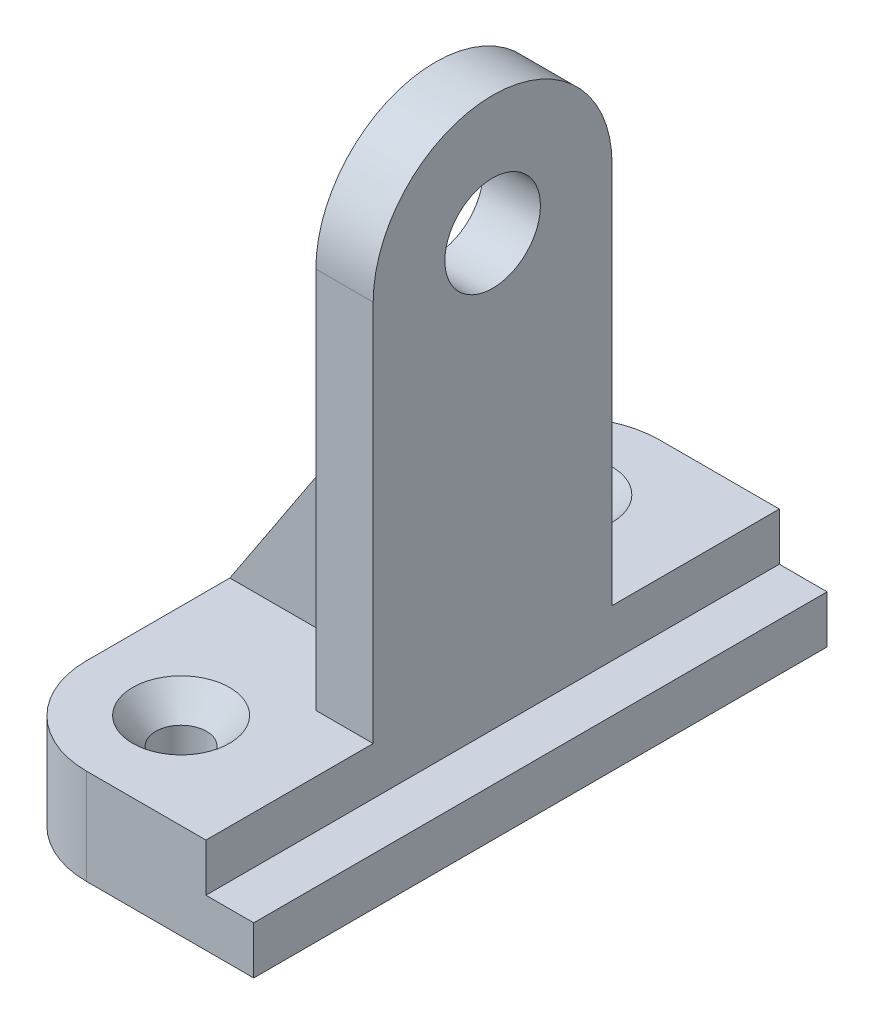
ISO-10303-21;
HEADER;
FILE_DESCRIPTION(('STEP AP214'),'2;1');
FILE_NAME('part.step','',(''),(''),'','','');
FILE_SCHEMA(('AUTOMOTIVE_DESIGN { 1 0 10303 214 1 1 1 1 }'));
ENDSEC;
DATA;
#1=APPLICATION_CONTEXT('core data for automotive mechanical design processes');
#2=APPLICATION_PROTOCOL_DEFINITION('international standard','automotive_design',2000,#1);
#3=PRODUCT_CONTEXT('',#1,'mechanical');
#4=PRODUCT('Part','Part','',(#3));
#5=PRODUCT_RELATED_PRODUCT_CATEGORY('part','',(#4));
#6=PRODUCT_DEFINITION_FORMATION('','',#4);
#7=PRODUCT_DEFINITION_CONTEXT('part definition',#1,'design');
#8=PRODUCT_DEFINITION('design','',#6,#7);
#9=PRODUCT_DEFINITION_SHAPE('','',#8);
#10=(LENGTH_UNIT() NAMED_UNIT(*) SI_UNIT(.MILLI.,.METRE.));
#11=(NAMED_UNIT(*) PLANE_ANGLE_UNIT() SI_UNIT($,.RADIAN.));
#12=(NAMED_UNIT(*) SI_UNIT($,.STERADIAN.) SOLID_ANGLE_UNIT());
#13=UNCERTAINTY_MEASURE_WITH_UNIT(LENGTH_MEASURE(1.E-05),#10,'distance_accuracy_value','');
#14=(GEOMETRIC_REPRESENTATION_CONTEXT(3) GLOBAL_UNCERTAINTY_ASSIGNED_CONTEXT((#13)) GLOBAL_UNIT_ASSIGNED_CONTEXT((#10,
#11,#12)) REPRESENTATION_CONTEXT('',''));
#15=CARTESIAN_POINT('',(0.,0.,0.));
#16=DIRECTION('',(0.,0.,1.));
#17=DIRECTION('',(1.,0.,0.));
#18=AXIS2_PLACEMENT_3D('',#15,#16,#17);
#19=CARTESIAN_POINT('',(-34.925,12.7,38.1));
#20=DIRECTION('',(0.,-1.,0.));
#21=DIRECTION('',(0.,0.,-1.));
#22=AXIS2_PLACEMENT_3D('',#19,#20,#21);
#23=PLANE('',#22);
#24=DIRECTION('',(0.,0.,-1.));
#25=VECTOR('',#24,1.);
#26=CARTESIAN_POINT('',(-34.925,12.7,38.1));
#27=LINE('',#26,#25);
#28=CARTESIAN_POINT('',(-34.925,12.7,25.4));
#29=VERTEX_POINT('',#28);
#30=CARTESIAN_POINT('',(-34.925,12.7,6.35000000000002));
#31=VERTEX_POINT('',#30);
#32=EDGE_CURVE('E278',#29,#31,#27,.T.);
#33=ORIENTED_EDGE('',*,*,#32,.F.);
#34=CARTESIAN_POINT('',(-22.225,12.7,25.4));
#35=DIRECTION('',(0.,-1.,0.));
#36=DIRECTION('',(0.,0.,-1.));
#37=AXIS2_PLACEMENT_3D('',#34,#35,#36);
#38=CIRCLE('',#37,12.7);
#39=CARTESIAN_POINT('',(-22.225,12.7,38.1));
#40=VERTEX_POINT('',#39);
#41=EDGE_CURVE('E11',#29,#40,#38,.F.);
#42=ORIENTED_EDGE('',*,*,#41,.T.);
#43=DIRECTION('',(-1.,0.,0.));
#44=VECTOR('',#43,1.);
#45=CARTESIAN_POINT('',(-34.925,12.7,38.1));
#46=LINE('',#45,#44);
#47=CARTESIAN_POINT('',(-6.35,12.7,38.1));
#48=VERTEX_POINT('',#47);
#49=EDGE_CURVE('E249',#48,#40,#46,.T.);
#50=ORIENTED_EDGE('',*,*,#49,.F.);
#51=DIRECTION('',(0.,0.,-1.));
#52=VECTOR('',#51,1.);
#53=CARTESIAN_POINT('',(-6.35,12.7,38.1));
#54=LINE('',#53,#52);
#55=CARTESIAN_POINT('',(-6.35,12.7,15.875));
#56=VERTEX_POINT('',#55);
#57=EDGE_CURVE('E282',#48,#56,#54,.T.);
#58=ORIENTED_EDGE('',*,*,#57,.T.);
#59=DIRECTION('',(1.,0.,0.));
#60=VECTOR('',#59,1.);
#61=CARTESIAN_POINT('',(-13.97,12.7,15.875));
#62=LINE('',#61,#60);
#63=CARTESIAN_POINT('',(-13.97,12.7,15.875));
#64=VERTEX_POINT('',#63);
#65=EDGE_CURVE('E230',#64,#56,#62,.T.);
#66=ORIENTED_EDGE('',*,*,#65,.F.);
#67=DIRECTION('',(0.,0.,1.));
#68=VECTOR('',#67,1.);
#69=CARTESIAN_POINT('',(-13.97,12.7,0.));
#70=LINE('',#69,#68);
#71=CARTESIAN_POINT('',(-13.97,12.7,6.35));
#72=VERTEX_POINT('',#71);
#73=EDGE_CURVE('E167',#72,#64,#70,.T.);
#74=ORIENTED_EDGE('',*,*,#73,.F.);
#75=DIRECTION('',(1.,0.,0.));
#76=VECTOR('',#75,1.);
#77=CARTESIAN_POINT('',(-13.97,12.7,6.35));
#78=LINE('',#77,#76);
#79=EDGE_CURVE('E186',#31,#72,#78,.T.);
#80=ORIENTED_EDGE('',*,*,#79,.F.);
#81=EDGE_LOOP('',(#33,#42,#50,#58,#66,#74,#80));
#82=FACE_BOUND('',#81,.T.);
#83=CARTESIAN_POINT('',(-22.352,12.7,25.4));
#84=DIRECTION('',(0.,1.,0.));
#85=DIRECTION('',(0.,0.,1.));
#86=AXIS2_PLACEMENT_3D('',#83,#84,#85);
#87=CIRCLE('',#86,6.4389);
#88=CARTESIAN_POINT('',(-22.352,12.7,31.8389));
#89=VERTEX_POINT('',#88);
#90=EDGE_CURVE('E344',#89,#89,#87,.T.);
#91=ORIENTED_EDGE('',*,*,#90,.F.);
#92=EDGE_LOOP('',(#91));
#93=FACE_BOUND('',#92,.T.);
#94=ADVANCED_FACE('F43',(#82,#93),#23,.F.);
#95=CARTESIAN_POINT('',(-22.352,12.7,-25.4));
#96=DIRECTION('',(0.,1.,0.));
#97=DIRECTION('',(0.,0.,1.));
#98=AXIS2_PLACEMENT_3D('',#95,#96,#97);
#99=CIRCLE('',#98,6.4389);
#100=CARTESIAN_POINT('',(-22.352,12.7,-18.9611));
#101=VERTEX_POINT('',#100);
#102=EDGE_CURVE('E627',#101,#101,#99,.T.);
#103=ORIENTED_EDGE('',*,*,#102,.F.);
#104=EDGE_LOOP('',(#103));
#105=FACE_BOUND('',#104,.T.);
#106=DIRECTION('',(-1.,0.,0.));
#107=VECTOR('',#106,1.);
#108=CARTESIAN_POINT('',(-34.925,12.7,-38.1));
#109=LINE('',#108,#107);
#110=CARTESIAN_POINT('',(-6.35,12.7,-38.1));
#111=VERTEX_POINT('',#110);
#112=CARTESIAN_POINT('',(-22.225,12.7,-38.1));
#113=VERTEX_POINT('',#112);
#114=EDGE_CURVE('E266',#111,#113,#109,.T.);
#115=ORIENTED_EDGE('',*,*,#114,.T.);
#116=CARTESIAN_POINT('',(-22.225,12.7,-25.4));
#117=DIRECTION('',(0.,-1.,0.));
#118=DIRECTION('',(0.,0.,-1.));
#119=AXIS2_PLACEMENT_3D('',#116,#117,#118);
#120=CIRCLE('',#119,12.7);
#121=CARTESIAN_POINT('',(-34.925,12.7,-25.4));
#122=VERTEX_POINT('',#121);
#123=EDGE_CURVE('E309',#113,#122,#120,.F.);
#124=ORIENTED_EDGE('',*,*,#123,.T.);
#125=CARTESIAN_POINT('',(-34.925,12.7,-6.34999999999999));
#126=VERTEX_POINT('',#125);
#127=EDGE_CURVE('E173',#126,#122,#27,.T.);
#128=ORIENTED_EDGE('',*,*,#127,.F.);
#129=DIRECTION('',(1.,0.,0.));
#130=VECTOR('',#129,1.);
#131=CARTESIAN_POINT('',(-13.97,12.7,-6.35));
#132=LINE('',#131,#130);
#133=CARTESIAN_POINT('',(-13.97,12.7,-6.35));
#134=VERTEX_POINT('',#133);
#135=EDGE_CURVE('E170',#126,#134,#132,.T.);
#136=ORIENTED_EDGE('',*,*,#135,.T.);
#137=CARTESIAN_POINT('',(-13.97,12.7,-15.875));
#138=VERTEX_POINT('',#137);
#139=EDGE_CURVE('E152',#138,#134,#70,.T.);
#140=ORIENTED_EDGE('',*,*,#139,.F.);
#141=DIRECTION('',(1.,0.,0.));
#142=VECTOR('',#141,1.);
#143=CARTESIAN_POINT('',(-13.97,12.7,-15.875));
#144=LINE('',#143,#142);
#145=CARTESIAN_POINT('',(-6.35,12.7,-15.875));
#146=VERTEX_POINT('',#145);
#147=EDGE_CURVE('E226',#138,#146,#144,.T.);
#148=ORIENTED_EDGE('',*,*,#147,.T.);
#149=EDGE_CURVE('E281',#146,#111,#54,.T.);
#150=ORIENTED_EDGE('',*,*,#149,.T.);
#151=EDGE_LOOP('',(#115,#124,#128,#136,#140,#148,#150));
#152=FACE_BOUND('',#151,.T.);
#153=ADVANCED_FACE('F171',(#105,#152),#23,.F.);
#154=CARTESIAN_POINT('',(0.,6.35,38.1));
#155=DIRECTION('',(-1.,0.,0.));
#156=DIRECTION('',(0.,-1.,0.));
#157=AXIS2_PLACEMENT_3D('',#154,#155,#156);
#158=PLANE('',#157);
#159=DIRECTION('',(0.,1.,0.));
#160=VECTOR('',#159,1.);
#161=CARTESIAN_POINT('',(0.,6.35,-38.1));
#162=LINE('',#161,#160);
#163=CARTESIAN_POINT('',(0.,0.,-38.1));
#164=VERTEX_POINT('',#163);
#165=CARTESIAN_POINT('',(0.,6.35,-38.1));
#166=VERTEX_POINT('',#165);
#167=EDGE_CURVE('E229',#164,#166,#162,.T.);
#168=ORIENTED_EDGE('',*,*,#167,.T.);
#169=DIRECTION('',(0.,0.,-1.));
#170=VECTOR('',#169,1.);
#171=CARTESIAN_POINT('',(0.,6.35,38.1));
#172=LINE('',#171,#170);
#173=CARTESIAN_POINT('',(0.,6.35,38.1));
#174=VERTEX_POINT('',#173);
#175=EDGE_CURVE('E290',#174,#166,#172,.T.);
#176=ORIENTED_EDGE('',*,*,#175,.F.);
#177=DIRECTION('',(0.,1.,0.));
#178=VECTOR('',#177,1.);
#179=CARTESIAN_POINT('',(0.,6.35,38.1));
#180=LINE('',#179,#178);
#181=CARTESIAN_POINT('',(0.,0.,38.1));
#182=VERTEX_POINT('',#181);
#183=EDGE_CURVE('E238',#182,#174,#180,.T.);
#184=ORIENTED_EDGE('',*,*,#183,.F.);
#185=DIRECTION('',(0.,0.,-1.));
#186=VECTOR('',#185,1.);
#187=CARTESIAN_POINT('',(0.,0.,38.1));
#188=LINE('',#187,#186);
#189=EDGE_CURVE('E255',#182,#164,#188,.T.);
#190=ORIENTED_EDGE('',*,*,#189,.T.);
#191=EDGE_LOOP('',(#168,#176,#184,#190));
#192=FACE_BOUND('',#191,.T.);
#193=ADVANCED_FACE('F326',(#192),#158,.F.);
#194=CARTESIAN_POINT('',(-6.35,6.35,38.1));
#195=DIRECTION('',(0.,-1.,0.));
#196=DIRECTION('',(0.,0.,-1.));
#197=AXIS2_PLACEMENT_3D('',#194,#195,#196);
#198=PLANE('',#197);
#199=DIRECTION('',(-1.,0.,0.));
#200=VECTOR('',#199,1.);
#201=CARTESIAN_POINT('',(-6.35,6.35,-38.1));
#202=LINE('',#201,#200);
#203=CARTESIAN_POINT('',(-6.35,6.35,-38.1));
#204=VERTEX_POINT('',#203);
#205=EDGE_CURVE('E259',#166,#204,#202,.T.);
#206=ORIENTED_EDGE('',*,*,#205,.T.);
#207=DIRECTION('',(0.,0.,-1.));
#208=VECTOR('',#207,1.);
#209=CARTESIAN_POINT('',(-6.35,6.35,38.1));
#210=LINE('',#209,#208);
#211=CARTESIAN_POINT('',(-6.35,6.35,38.1));
#212=VERTEX_POINT('',#211);
#213=EDGE_CURVE('E286',#212,#204,#210,.T.);
#214=ORIENTED_EDGE('',*,*,#213,.F.);
#215=DIRECTION('',(-1.,0.,0.));
#216=VECTOR('',#215,1.);
#217=CARTESIAN_POINT('',(-6.35,6.35,38.1));
#218=LINE('',#217,#216);
#219=EDGE_CURVE('E242',#174,#212,#218,.T.);
#220=ORIENTED_EDGE('',*,*,#219,.F.);
#221=ORIENTED_EDGE('',*,*,#175,.T.);
#222=EDGE_LOOP('',(#206,#214,#220,#221));
#223=FACE_BOUND('',#222,.T.);
#224=ADVANCED_FACE('F331',(#223),#198,.F.);
#225=CARTESIAN_POINT('',(-6.35,12.7,38.1));
#226=DIRECTION('',(-1.,0.,0.));
#227=DIRECTION('',(0.,-1.,0.));
#228=AXIS2_PLACEMENT_3D('',#225,#226,#227);
#229=PLANE('',#228);
#230=DIRECTION('',(0.,1.,0.));
#231=VECTOR('',#230,1.);
#232=CARTESIAN_POINT('',(-6.35,12.7,-38.1));
#233=LINE('',#232,#231);
#234=EDGE_CURVE('E262',#204,#111,#233,.T.);
#235=ORIENTED_EDGE('',*,*,#234,.T.);
#236=ORIENTED_EDGE('',*,*,#149,.F.);
#237=DIRECTION('',(0.,-1.,0.));
#238=VECTOR('',#237,1.);
#239=CARTESIAN_POINT('',(-6.35,0.,-15.875));
#240=LINE('',#239,#238);
#241=CARTESIAN_POINT('',(-6.35000000000002,63.5,-15.875));
#242=VERTEX_POINT('',#241);
#243=EDGE_CURVE('E197',#242,#146,#240,.T.);
#244=ORIENTED_EDGE('',*,*,#243,.F.);
#245=CARTESIAN_POINT('',(-6.35000000000002,63.5,0.));
#246=DIRECTION('',(1.,0.,0.));
#247=DIRECTION('',(0.,1.,0.));
#248=AXIS2_PLACEMENT_3D('',#245,#246,#247);
#249=CIRCLE('',#248,15.875);
#250=CARTESIAN_POINT('',(-6.35000000000002,63.5,15.875));
#251=VERTEX_POINT('',#250);
#252=EDGE_CURVE('E215',#242,#251,#249,.T.);
#253=ORIENTED_EDGE('',*,*,#252,.T.);
#254=DIRECTION('',(0.,-1.,0.));
#255=VECTOR('',#254,1.);
#256=CARTESIAN_POINT('',(-6.35,0.,15.875));
#257=LINE('',#256,#255);
#258=EDGE_CURVE('E219',#251,#56,#257,.T.);
#259=ORIENTED_EDGE('',*,*,#258,.T.);
#260=ORIENTED_EDGE('',*,*,#57,.F.);
#261=DIRECTION('',(0.,1.,0.));
#262=VECTOR('',#261,1.);
#263=CARTESIAN_POINT('',(-6.35,12.7,38.1));
#264=LINE('',#263,#262);
#265=EDGE_CURVE('E246',#212,#48,#264,.T.);
#266=ORIENTED_EDGE('',*,*,#265,.F.);
#267=ORIENTED_EDGE('',*,*,#213,.T.);
#268=EDGE_LOOP('',(#235,#236,#244,#253,#259,#260,#266,#267));
#269=FACE_BOUND('',#268,.T.);
#270=CARTESIAN_POINT('',(-6.35000000000002,63.5,0.));
#271=DIRECTION('',(1.,0.,0.));
#272=DIRECTION('',(0.,1.,0.));
#273=AXIS2_PLACEMENT_3D('',#270,#271,#272);
#274=CIRCLE('',#273,6.35);
#275=CARTESIAN_POINT('',(-6.35000000000002,69.85,0.));
#276=VERTEX_POINT('',#275);
#277=EDGE_CURVE('E201',#276,#276,#274,.T.);
#278=ORIENTED_EDGE('',*,*,#277,.F.);
#279=EDGE_LOOP('',(#278));
#280=FACE_BOUND('',#279,.T.);
#281=ADVANCED_FACE('F334',(#269,#280),#229,.F.);
#282=CARTESIAN_POINT('',(-34.925,0.,38.1));
#283=DIRECTION('',(1.,0.,0.));
#284=DIRECTION('',(0.,0.,-1.));
#285=AXIS2_PLACEMENT_3D('',#282,#283,#284);
#286=PLANE('',#285);
#287=ORIENTED_EDGE('',*,*,#127,.T.);
#288=DIRECTION('',(0.,-1.,0.));
#289=VECTOR('',#288,1.);
#290=CARTESIAN_POINT('',(-34.925,0.,-25.4));
#291=LINE('',#290,#289);
#292=CARTESIAN_POINT('',(-34.925,0.,-25.4));
#293=VERTEX_POINT('',#292);
#294=EDGE_CURVE('E297',#122,#293,#291,.T.);
#295=ORIENTED_EDGE('',*,*,#294,.T.);
#296=DIRECTION('',(0.,0.,-1.));
#297=VECTOR('',#296,1.);
#298=CARTESIAN_POINT('',(-34.925,0.,38.1));
#299=LINE('',#298,#297);
#300=CARTESIAN_POINT('',(-34.925,0.,25.4));
#301=VERTEX_POINT('',#300);
#302=EDGE_CURVE('E274',#301,#293,#299,.T.);
#303=ORIENTED_EDGE('',*,*,#302,.F.);
#304=DIRECTION('',(0.,-1.,0.));
#305=VECTOR('',#304,1.);
#306=CARTESIAN_POINT('',(-34.925,0.,25.4));
#307=LINE('',#306,#305);
#308=EDGE_CURVE('E294',#301,#29,#307,.F.);
#309=ORIENTED_EDGE('',*,*,#308,.T.);
#310=ORIENTED_EDGE('',*,*,#32,.T.);
#311=DIRECTION('',(0.,0.,-1.));
#312=VECTOR('',#311,1.);
#313=CARTESIAN_POINT('',(-34.925,12.7,6.35));
#314=LINE('',#313,#312);
#315=EDGE_CURVE('E190',#31,#126,#314,.T.);
#316=ORIENTED_EDGE('',*,*,#315,.T.);
#317=EDGE_LOOP('',(#287,#295,#303,#309,#310,#316));
#318=FACE_BOUND('',#317,.T.);
#319=ADVANCED_FACE('F377',(#318),#286,.F.);
#320=CARTESIAN_POINT('',(0.,0.,38.1));
#321=DIRECTION('',(0.,1.,0.));
#322=DIRECTION('',(0.,0.,1.));
#323=AXIS2_PLACEMENT_3D('',#320,#321,#322);
#324=PLANE('',#323);
#325=CARTESIAN_POINT('',(-22.352,0.,-25.4));
#326=DIRECTION('',(0.,1.,0.));
#327=DIRECTION('',(0.,0.,1.));
#328=AXIS2_PLACEMENT_3D('',#325,#326,#327);
#329=CIRCLE('',#328,3.3782);
#330=CARTESIAN_POINT('',(-22.352,0.,-22.0218));
#331=VERTEX_POINT('',#330);
#332=EDGE_CURVE('E348',#331,#331,#329,.T.);
#333=ORIENTED_EDGE('',*,*,#332,.T.);
#334=EDGE_LOOP('',(#333));
#335=FACE_BOUND('',#334,.T.);
#336=CARTESIAN_POINT('',(-22.352,0.,25.4));
#337=DIRECTION('',(0.,1.,0.));
#338=DIRECTION('',(0.,0.,1.));
#339=AXIS2_PLACEMENT_3D('',#336,#337,#338);
#340=CIRCLE('',#339,3.3782);
#341=CARTESIAN_POINT('',(-22.352,0.,28.7782));
#342=VERTEX_POINT('',#341);
#343=EDGE_CURVE('E178',#342,#342,#340,.T.);
#344=ORIENTED_EDGE('',*,*,#343,.T.);
#345=EDGE_LOOP('',(#344));
#346=FACE_BOUND('',#345,.T.);
#347=ORIENTED_EDGE('',*,*,#302,.T.);
#348=CARTESIAN_POINT('',(-22.225,0.,-25.4));
#349=DIRECTION('',(0.,1.,0.));
#350=DIRECTION('',(0.,0.,1.));
#351=AXIS2_PLACEMENT_3D('',#348,#349,#350);
#352=CIRCLE('',#351,12.7);
#353=CARTESIAN_POINT('',(-22.225,0.,-38.1));
#354=VERTEX_POINT('',#353);
#355=EDGE_CURVE('E304',#293,#354,#352,.F.);
#356=ORIENTED_EDGE('',*,*,#355,.T.);
#357=DIRECTION('',(1.,0.,0.));
#358=VECTOR('',#357,1.);
#359=CARTESIAN_POINT('',(0.,0.,-38.1));
#360=LINE('',#359,#358);
#361=EDGE_CURVE('E243',#354,#164,#360,.T.);
#362=ORIENTED_EDGE('',*,*,#361,.T.);
#363=ORIENTED_EDGE('',*,*,#189,.F.);
#364=DIRECTION('',(1.,0.,0.));
#365=VECTOR('',#364,1.);
#366=CARTESIAN_POINT('',(0.,0.,38.1));
#367=LINE('',#366,#365);
#368=CARTESIAN_POINT('',(-22.225,0.,38.1));
#369=VERTEX_POINT('',#368);
#370=EDGE_CURVE('E252',#369,#182,#367,.T.);
#371=ORIENTED_EDGE('',*,*,#370,.F.);
#372=CARTESIAN_POINT('',(-22.225,0.,25.4));
#373=DIRECTION('',(0.,1.,0.));
#374=DIRECTION('',(0.,0.,1.));
#375=AXIS2_PLACEMENT_3D('',#372,#373,#374);
#376=CIRCLE('',#375,12.7);
#377=EDGE_CURVE('E301',#369,#301,#376,.F.);
#378=ORIENTED_EDGE('',*,*,#377,.T.);
#379=EDGE_LOOP('',(#347,#356,#362,#363,#371,#378));
#380=FACE_BOUND('',#379,.T.);
#381=ADVANCED_FACE('F320',(#335,#346,#380),#324,.F.);
#382=CARTESIAN_POINT('',(0.,0.,38.1));
#383=DIRECTION('',(0.,0.,-1.));
#384=DIRECTION('',(-1.,0.,0.));
#385=AXIS2_PLACEMENT_3D('',#382,#383,#384);
#386=PLANE('',#385);
#387=ORIENTED_EDGE('',*,*,#49,.T.);
#388=DIRECTION('',(0.,-1.,0.));
#389=VECTOR('',#388,1.);
#390=CARTESIAN_POINT('',(-22.225,0.,38.1));
#391=LINE('',#390,#389);
#392=EDGE_CURVE('E52',#40,#369,#391,.T.);
#393=ORIENTED_EDGE('',*,*,#392,.T.);
#394=ORIENTED_EDGE('',*,*,#370,.T.);
#395=ORIENTED_EDGE('',*,*,#183,.T.);
#396=ORIENTED_EDGE('',*,*,#219,.T.);
#397=ORIENTED_EDGE('',*,*,#265,.T.);
#398=EDGE_LOOP('',(#387,#393,#394,#395,#396,#397));
#399=FACE_BOUND('',#398,.T.);
#400=ADVANCED_FACE('F316',(#399),#386,.F.);
#401=CARTESIAN_POINT('',(0.,0.,-38.1));
#402=DIRECTION('',(0.,0.,-1.));
#403=DIRECTION('',(-1.,0.,0.));
#404=AXIS2_PLACEMENT_3D('',#401,#402,#403);
#405=PLANE('',#404);
#406=ORIENTED_EDGE('',*,*,#361,.F.);
#407=DIRECTION('',(0.,-1.,0.));
#408=VECTOR('',#407,1.);
#409=CARTESIAN_POINT('',(-22.225,12.7,-38.1));
#410=LINE('',#409,#408);
#411=EDGE_CURVE('E65',#354,#113,#410,.F.);
#412=ORIENTED_EDGE('',*,*,#411,.T.);
#413=ORIENTED_EDGE('',*,*,#114,.F.);
#414=ORIENTED_EDGE('',*,*,#234,.F.);
#415=ORIENTED_EDGE('',*,*,#205,.F.);
#416=ORIENTED_EDGE('',*,*,#167,.F.);
#417=EDGE_LOOP('',(#406,#412,#413,#414,#415,#416));
#418=FACE_BOUND('',#417,.T.);
#419=ADVANCED_FACE('F388',(#418),#405,.T.);
#420=CARTESIAN_POINT('',(-13.97,0.,-15.875));
#421=DIRECTION('',(0.,0.,1.));
#422=DIRECTION('',(0.,-1.,0.));
#423=AXIS2_PLACEMENT_3D('',#420,#421,#422);
#424=PLANE('',#423);
#425=ORIENTED_EDGE('',*,*,#243,.T.);
#426=ORIENTED_EDGE('',*,*,#147,.F.);
#427=DIRECTION('',(0.,-1.,0.));
#428=VECTOR('',#427,1.);
#429=CARTESIAN_POINT('',(-13.97,0.,-15.875));
#430=LINE('',#429,#428);
#431=CARTESIAN_POINT('',(-13.97,63.5,-15.875));
#432=VERTEX_POINT('',#431);
#433=EDGE_CURVE('E161',#432,#138,#430,.T.);
#434=ORIENTED_EDGE('',*,*,#433,.F.);
#435=DIRECTION('',(1.,0.,0.));
#436=VECTOR('',#435,1.);
#437=CARTESIAN_POINT('',(-13.97,63.5,-15.875));
#438=LINE('',#437,#436);
#439=EDGE_CURVE('E212',#432,#242,#438,.T.);
#440=ORIENTED_EDGE('',*,*,#439,.T.);
#441=EDGE_LOOP('',(#425,#426,#434,#440));
#442=FACE_BOUND('',#441,.T.);
#443=ADVANCED_FACE('F390',(#442),#424,.F.);
#444=CARTESIAN_POINT('',(-13.97,0.,15.875));
#445=DIRECTION('',(0.,0.,1.));
#446=DIRECTION('',(0.,-1.,0.));
#447=AXIS2_PLACEMENT_3D('',#444,#445,#446);
#448=PLANE('',#447);
#449=ORIENTED_EDGE('',*,*,#258,.F.);
#450=DIRECTION('',(1.,0.,0.));
#451=VECTOR('',#450,1.);
#452=CARTESIAN_POINT('',(-13.97,63.5,15.875));
#453=LINE('',#452,#451);
#454=CARTESIAN_POINT('',(-13.97,63.5,15.875));
#455=VERTEX_POINT('',#454);
#456=EDGE_CURVE('E233',#455,#251,#453,.T.);
#457=ORIENTED_EDGE('',*,*,#456,.F.);
#458=DIRECTION('',(0.,-1.,0.));
#459=VECTOR('',#458,1.);
#460=CARTESIAN_POINT('',(-13.97,0.,15.875));
#461=LINE('',#460,#459);
#462=EDGE_CURVE('E205',#455,#64,#461,.T.);
#463=ORIENTED_EDGE('',*,*,#462,.T.);
#464=ORIENTED_EDGE('',*,*,#65,.T.);
#465=EDGE_LOOP('',(#449,#457,#463,#464));
#466=FACE_BOUND('',#465,.T.);
#467=ADVANCED_FACE('F397',(#466),#448,.T.);
#468=CARTESIAN_POINT('',(-13.97,63.5,0.));
#469=DIRECTION('',(1.,0.,0.));
#470=DIRECTION('',(0.,1.,0.));
#471=AXIS2_PLACEMENT_3D('',#468,#469,#470);
#472=CYLINDRICAL_SURFACE('',#471,15.875);
#473=ORIENTED_EDGE('',*,*,#252,.F.);
#474=ORIENTED_EDGE('',*,*,#439,.F.);
#475=CARTESIAN_POINT('',(-13.97,63.5,0.));
#476=DIRECTION('',(1.,0.,0.));
#477=DIRECTION('',(0.,1.,0.));
#478=AXIS2_PLACEMENT_3D('',#475,#476,#477);
#479=CIRCLE('',#478,15.875);
#480=EDGE_CURVE('E200',#432,#455,#479,.T.);
#481=ORIENTED_EDGE('',*,*,#480,.T.);
#482=ORIENTED_EDGE('',*,*,#456,.T.);
#483=EDGE_LOOP('',(#473,#474,#481,#482));
#484=FACE_BOUND('',#483,.T.);
#485=ADVANCED_FACE('F433',(#484),#472,.T.);
#486=CARTESIAN_POINT('',(-13.97,63.5,0.));
#487=DIRECTION('',(1.,0.,0.));
#488=DIRECTION('',(0.,1.,0.));
#489=AXIS2_PLACEMENT_3D('',#486,#487,#488);
#490=CYLINDRICAL_SURFACE('',#489,6.35);
#491=CARTESIAN_POINT('',(-13.97,63.5,0.));
#492=DIRECTION('',(1.,0.,0.));
#493=DIRECTION('',(0.,1.,0.));
#494=AXIS2_PLACEMENT_3D('',#491,#492,#493);
#495=CIRCLE('',#494,6.35);
#496=CARTESIAN_POINT('',(-13.97,69.85,0.));
#497=VERTEX_POINT('',#496);
#498=EDGE_CURVE('E166',#497,#497,#495,.T.);
#499=CARTESIAN_POINT('',(-13.97,69.85,0.));
#500=CARTESIAN_POINT('',(-13.890625,69.85,0.));
#501=CARTESIAN_POINT('',(-13.81125,69.85,0.));
#502=CARTESIAN_POINT('',(-13.6525,69.85,0.));
#503=CARTESIAN_POINT('',(-13.573125,69.85,0.));
#504=CARTESIAN_POINT('',(-13.414375,69.85,0.));
#505=CARTESIAN_POINT('',(-13.335,69.85,0.));
#506=CARTESIAN_POINT('',(-13.17625,69.85,0.));
#507=CARTESIAN_POINT('',(-13.096875,69.85,0.));
#508=CARTESIAN_POINT('',(-12.938125,69.85,0.));
#509=CARTESIAN_POINT('',(-12.85875,69.85,0.));
#510=CARTESIAN_POINT('',(-12.7,69.85,0.));
#511=CARTESIAN_POINT('',(-12.620625,69.85,0.));
#512=CARTESIAN_POINT('',(-12.461875,69.85,0.));
#513=CARTESIAN_POINT('',(-12.3825,69.85,0.));
#514=CARTESIAN_POINT('',(-12.22375,69.85,0.));
#515=CARTESIAN_POINT('',(-12.144375,69.85,0.));
#516=CARTESIAN_POINT('',(-11.985625,69.85,0.));
#517=CARTESIAN_POINT('',(-11.90625,69.85,0.));
#518=CARTESIAN_POINT('',(-11.7475,69.85,0.));
#519=CARTESIAN_POINT('',(-11.668125,69.85,0.));
#520=CARTESIAN_POINT('',(-11.509375,69.85,0.));
#521=CARTESIAN_POINT('',(-11.43,69.85,0.));
#522=CARTESIAN_POINT('',(-11.27125,69.85,0.));
#523=CARTESIAN_POINT('',(-11.191875,69.85,0.));
#524=CARTESIAN_POINT('',(-11.033125,69.85,0.));
#525=CARTESIAN_POINT('',(-10.95375,69.85,0.));
#526=CARTESIAN_POINT('',(-10.795,69.85,0.));
#527=CARTESIAN_POINT('',(-10.715625,69.85,0.));
#528=CARTESIAN_POINT('',(-10.556875,69.85,0.));
#529=CARTESIAN_POINT('',(-10.4775,69.85,0.));
#530=CARTESIAN_POINT('',(-10.31875,69.85,0.));
#531=CARTESIAN_POINT('',(-10.239375,69.85,0.));
#532=CARTESIAN_POINT('',(-10.080625,69.85,0.));
#533=CARTESIAN_POINT('',(-10.00125,69.85,0.));
#534=CARTESIAN_POINT('',(-9.84250000000002,69.85,0.));
#535=CARTESIAN_POINT('',(-9.76312500000002,69.85,0.));
#536=CARTESIAN_POINT('',(-9.60437500000002,69.85,0.));
#537=CARTESIAN_POINT('',(-9.52500000000002,69.85,0.));
#538=CARTESIAN_POINT('',(-9.36625000000002,69.85,0.));
#539=CARTESIAN_POINT('',(-9.28687500000002,69.85,0.));
#540=CARTESIAN_POINT('',(-9.12812500000002,69.85,0.));
#541=CARTESIAN_POINT('',(-9.04875000000002,69.85,0.));
#542=CARTESIAN_POINT('',(-8.89000000000002,69.85,0.));
#543=CARTESIAN_POINT('',(-8.81062500000002,69.85,0.));
#544=CARTESIAN_POINT('',(-8.65187500000002,69.85,0.));
#545=CARTESIAN_POINT('',(-8.57250000000002,69.85,0.));
#546=CARTESIAN_POINT('',(-8.41375000000002,69.85,0.));
#547=CARTESIAN_POINT('',(-8.33437500000002,69.85,0.));
#548=CARTESIAN_POINT('',(-8.17562500000002,69.85,0.));
#549=CARTESIAN_POINT('',(-8.09625000000002,69.85,0.));
#550=CARTESIAN_POINT('',(-7.93750000000002,69.85,0.));
#551=CARTESIAN_POINT('',(-7.85812500000002,69.85,0.));
#552=CARTESIAN_POINT('',(-7.69937500000002,69.85,0.));
#553=CARTESIAN_POINT('',(-7.62000000000002,69.85,0.));
#554=CARTESIAN_POINT('',(-7.46125000000002,69.85,0.));
#555=CARTESIAN_POINT('',(-7.38187500000002,69.85,0.));
#556=CARTESIAN_POINT('',(-7.22312500000002,69.85,0.));
#557=CARTESIAN_POINT('',(-7.14375000000002,69.85,0.));
#558=CARTESIAN_POINT('',(-6.98500000000002,69.85,0.));
#559=CARTESIAN_POINT('',(-6.90562500000002,69.85,0.));
#560=CARTESIAN_POINT('',(-6.74687500000002,69.85,0.));
#561=CARTESIAN_POINT('',(-6.66750000000002,69.85,0.));
#562=CARTESIAN_POINT('',(-6.50875000000002,69.85,0.));
#563=CARTESIAN_POINT('',(-6.42937500000002,69.85,0.));
#564=CARTESIAN_POINT('',(-6.35000000000002,69.85,0.));
#565=B_SPLINE_CURVE_WITH_KNOTS('',3,(#499,#500,#501,#502,#503,#504,#505,#506,#507,#508,#509,
#510,#511,#512,#513,#514,#515,#516,#517,#518,#519,#520,#521,#522,#523,#524,#525,#526,#527,#528,
#529,#530,#531,#532,#533,#534,#535,#536,#537,#538,#539,#540,#541,#542,#543,#544,#545,#546,#547,
#548,#549,#550,#551,#552,#553,#554,#555,#556,#557,#558,#559,#560,#561,#562,#563,#564),
.UNSPECIFIED.,.F.,.F.,(4,2,2,2,2,2,2,2,2,2,2,2,2,2,2,2,2,2,2,2,2,2,2,2,2,2,2,2,2,2,2,2,4),(0.,
0.238124999999999,0.476249999999999,0.714375,0.952499999999998,1.190625,1.42875,1.666875,1.905,
2.143125,2.38125,2.619375,2.8575,3.095625,3.33375,3.571875,3.81,4.048125,4.28625,4.524375,
4.7625,5.000625,5.23875,5.476875,5.715,5.953125,6.19125,6.429375,6.6675,6.905625,7.14375,
7.381875,7.62),.UNSPECIFIED.);
#566=EDGE_CURVE('BSEAM430',#497,#276,#565,.T.);
#567=ORIENTED_EDGE('',*,*,#498,.F.);
#568=ORIENTED_EDGE('',*,*,#277,.T.);
#569=ORIENTED_EDGE('',*,*,#566,.T.);
#570=ORIENTED_EDGE('',*,*,#566,.F.);
#571=EDGE_LOOP('',(#567,#569,#568,#570));
#572=FACE_BOUND('',#571,.T.);
#573=ADVANCED_FACE('F430',(#572),#490,.F.);
#574=CARTESIAN_POINT('',(-13.97,0.,0.));
#575=DIRECTION('',(1.,0.,0.));
#576=DIRECTION('',(0.,1.,0.));
#577=AXIS2_PLACEMENT_3D('',#574,#575,#576);
#578=PLANE('',#577);
#579=DIRECTION('',(0.,0.,-1.));
#580=VECTOR('',#579,1.);
#581=CARTESIAN_POINT('',(-13.97,44.45,6.35));
#582=LINE('',#581,#580);
#583=CARTESIAN_POINT('',(-13.97,44.45,6.35));
#584=VERTEX_POINT('',#583);
#585=CARTESIAN_POINT('',(-13.97,44.45,-6.35));
#586=VERTEX_POINT('',#585);
#587=EDGE_CURVE('E193',#584,#586,#582,.T.);
#588=ORIENTED_EDGE('',*,*,#587,.F.);
#589=DIRECTION('',(0.,1.,0.));
#590=VECTOR('',#589,1.);
#591=CARTESIAN_POINT('',(-13.97,44.45,6.35));
#592=LINE('',#591,#590);
#593=EDGE_CURVE('E365',#72,#584,#592,.T.);
#594=ORIENTED_EDGE('',*,*,#593,.F.);
#595=ORIENTED_EDGE('',*,*,#73,.T.);
#596=ORIENTED_EDGE('',*,*,#462,.F.);
#597=ORIENTED_EDGE('',*,*,#480,.F.);
#598=ORIENTED_EDGE('',*,*,#433,.T.);
#599=ORIENTED_EDGE('',*,*,#139,.T.);
#600=DIRECTION('',(0.,1.,0.));
#601=VECTOR('',#600,1.);
#602=CARTESIAN_POINT('',(-13.97,44.45,-6.35));
#603=LINE('',#602,#601);
#604=EDGE_CURVE('E157',#134,#586,#603,.T.);
#605=ORIENTED_EDGE('',*,*,#604,.T.);
#606=EDGE_LOOP('',(#588,#594,#595,#596,#597,#598,#599,#605));
#607=FACE_BOUND('',#606,.T.);
#608=ORIENTED_EDGE('',*,*,#498,.T.);
#609=EDGE_LOOP('',(#608));
#610=FACE_BOUND('',#609,.T.);
#611=ADVANCED_FACE('F154',(#607,#610),#578,.F.);
#612=CARTESIAN_POINT('',(-34.925,12.7,6.35));
#613=DIRECTION('',(0.834609406561725,-0.550842208330738,0.));
#614=DIRECTION('',(0.550842208330738,0.834609406561725,0.));
#615=AXIS2_PLACEMENT_3D('',#612,#613,#614);
#616=PLANE('',#615);
#617=DIRECTION('',(-0.550842208330738,-0.834609406561725,0.));
#618=VECTOR('',#617,1.);
#619=CARTESIAN_POINT('',(-34.925,12.7,-6.35));
#620=LINE('',#619,#618);
#621=EDGE_CURVE('E182',#586,#126,#620,.T.);
#622=ORIENTED_EDGE('',*,*,#621,.T.);
#623=ORIENTED_EDGE('',*,*,#315,.F.);
#624=DIRECTION('',(-0.550842208330738,-0.834609406561725,0.));
#625=VECTOR('',#624,1.);
#626=CARTESIAN_POINT('',(-34.925,12.7,6.35));
#627=LINE('',#626,#625);
#628=EDGE_CURVE('E194',#584,#31,#627,.T.);
#629=ORIENTED_EDGE('',*,*,#628,.F.);
#630=ORIENTED_EDGE('',*,*,#587,.T.);
#631=EDGE_LOOP('',(#622,#623,#629,#630));
#632=FACE_BOUND('',#631,.T.);
#633=ADVANCED_FACE('F375',(#632),#616,.F.);
#634=CARTESIAN_POINT('',(0.,0.,6.35));
#635=DIRECTION('',(0.,0.,1.));
#636=DIRECTION('',(1.,0.,0.));
#637=AXIS2_PLACEMENT_3D('',#634,#635,#636);
#638=PLANE('',#637);
#639=ORIENTED_EDGE('',*,*,#79,.T.);
#640=ORIENTED_EDGE('',*,*,#593,.T.);
#641=ORIENTED_EDGE('',*,*,#628,.T.);
#642=EDGE_LOOP('',(#639,#640,#641));
#643=FACE_BOUND('',#642,.T.);
#644=ADVANCED_FACE('F373',(#643),#638,.T.);
#645=CARTESIAN_POINT('',(0.,0.,-6.35));
#646=DIRECTION('',(0.,0.,1.));
#647=DIRECTION('',(1.,0.,0.));
#648=AXIS2_PLACEMENT_3D('',#645,#646,#647);
#649=PLANE('',#648);
#650=ORIENTED_EDGE('',*,*,#135,.F.);
#651=ORIENTED_EDGE('',*,*,#621,.F.);
#652=ORIENTED_EDGE('',*,*,#604,.F.);
#653=EDGE_LOOP('',(#650,#651,#652));
#654=FACE_BOUND('',#653,.T.);
#655=ADVANCED_FACE('F180',(#654),#649,.F.);
#656=CARTESIAN_POINT('',(-22.225,0.,-25.4));
#657=DIRECTION('',(0.,1.,0.));
#658=DIRECTION('',(0.,0.,1.));
#659=AXIS2_PLACEMENT_3D('',#656,#657,#658);
#660=CYLINDRICAL_SURFACE('',#659,12.7);
#661=ORIENTED_EDGE('',*,*,#123,.F.);
#662=ORIENTED_EDGE('',*,*,#411,.F.);
#663=ORIENTED_EDGE('',*,*,#355,.F.);
#664=ORIENTED_EDGE('',*,*,#294,.F.);
#665=EDGE_LOOP('',(#661,#662,#663,#664));
#666=FACE_BOUND('',#665,.T.);
#667=ADVANCED_FACE('F412',(#666),#660,.T.);
#668=CARTESIAN_POINT('',(-22.225,0.,25.4));
#669=DIRECTION('',(0.,-1.,0.));
#670=DIRECTION('',(0.,0.,-1.));
#671=AXIS2_PLACEMENT_3D('',#668,#669,#670);
#672=CYLINDRICAL_SURFACE('',#671,12.7);
#673=ORIENTED_EDGE('',*,*,#41,.F.);
#674=ORIENTED_EDGE('',*,*,#308,.F.);
#675=ORIENTED_EDGE('',*,*,#377,.F.);
#676=ORIENTED_EDGE('',*,*,#392,.F.);
#677=EDGE_LOOP('',(#673,#674,#675,#676));
#678=FACE_BOUND('',#677,.T.);
#679=ADVANCED_FACE('F45',(#678),#672,.T.);
#680=CARTESIAN_POINT('',(-22.352,12.7,25.4));
#681=DIRECTION('',(0.,1.,0.));
#682=DIRECTION('',(0.,0.,1.));
#683=AXIS2_PLACEMENT_3D('',#680,#681,#682);
#684=CYLINDRICAL_SURFACE('',#683,3.3782);
#685=ORIENTED_EDGE('',*,*,#343,.F.);
#686=EDGE_LOOP('',(#685));
#687=FACE_BOUND('',#686,.T.);
#688=CARTESIAN_POINT('',(-22.352,9.17906741601865,25.4));
#689=DIRECTION('',(0.,1.,0.));
#690=DIRECTION('',(0.,0.,1.));
#691=AXIS2_PLACEMENT_3D('',#688,#689,#690);
#692=CIRCLE('',#691,3.3782);
#693=CARTESIAN_POINT('',(-22.352,9.17906741601865,28.7782));
#694=VERTEX_POINT('',#693);
#695=EDGE_CURVE('E347',#694,#694,#692,.T.);
#696=ORIENTED_EDGE('',*,*,#695,.T.);
#697=EDGE_LOOP('',(#696));
#698=FACE_BOUND('',#697,.T.);
#699=ADVANCED_FACE('F418',(#687,#698),#684,.F.);
#700=CARTESIAN_POINT('',(-22.352,12.7,25.4));
#701=DIRECTION('',(0.,1.,0.));
#702=DIRECTION('',(0.,0.,1.));
#703=AXIS2_PLACEMENT_3D('',#700,#701,#702);
#704=CONICAL_SURFACE('',#703,6.4389,0.715584993317675);
#705=ORIENTED_EDGE('',*,*,#695,.F.);
#706=EDGE_LOOP('',(#705));
#707=FACE_BOUND('',#706,.T.);
#708=ORIENTED_EDGE('',*,*,#90,.T.);
#709=EDGE_LOOP('',(#708));
#710=FACE_BOUND('',#709,.T.);
#711=ADVANCED_FACE('F582',(#707,#710),#704,.F.);
#712=CARTESIAN_POINT('',(-22.352,12.7,-25.4));
#713=DIRECTION('',(0.,1.,0.));
#714=DIRECTION('',(0.,0.,1.));
#715=AXIS2_PLACEMENT_3D('',#712,#713,#714);
#716=CYLINDRICAL_SURFACE('',#715,3.3782);
#717=ORIENTED_EDGE('',*,*,#332,.F.);
#718=EDGE_LOOP('',(#717));
#719=FACE_BOUND('',#718,.T.);
#720=CARTESIAN_POINT('',(-22.352,9.17906741601865,-25.4));
#721=DIRECTION('',(0.,1.,0.));
#722=DIRECTION('',(0.,0.,1.));
#723=AXIS2_PLACEMENT_3D('',#720,#721,#722);
#724=CIRCLE('',#723,3.3782);
#725=CARTESIAN_POINT('',(-22.352,9.17906741601865,-22.0218));
#726=VERTEX_POINT('',#725);
#727=EDGE_CURVE('E355',#726,#726,#724,.T.);
#728=ORIENTED_EDGE('',*,*,#727,.T.);
#729=EDGE_LOOP('',(#728));
#730=FACE_BOUND('',#729,.T.);
#731=ADVANCED_FACE('F591',(#719,#730),#716,.F.);
#732=CARTESIAN_POINT('',(-22.352,12.7,-25.4));
#733=DIRECTION('',(0.,1.,0.));
#734=DIRECTION('',(0.,0.,1.));
#735=AXIS2_PLACEMENT_3D('',#732,#733,#734);
#736=CONICAL_SURFACE('',#735,6.4389,0.715584993317675);
#737=ORIENTED_EDGE('',*,*,#727,.F.);
#738=EDGE_LOOP('',(#737));
#739=FACE_BOUND('',#738,.T.);
#740=ORIENTED_EDGE('',*,*,#102,.T.);
#741=EDGE_LOOP('',(#740));
#742=FACE_BOUND('',#741,.T.);
#743=ADVANCED_FACE('F602',(#739,#742),#736,.F.);
#744=CLOSED_SHELL('',(#94,#153,#193,#224,#281,#319,#381,#400,#419,#443,#467,#485,#573,#611,#633,
#644,#655,#667,#679,#699,#711,#731,#743));
#745=MANIFOLD_SOLID_BREP('B2',#744);
#746=ADVANCED_BREP_SHAPE_REPRESENTATION('',(#18,#745),#14);
#747=SHAPE_DEFINITION_REPRESENTATION(#9,#746);
ENDSEC;
END-ISO-10303-21;
